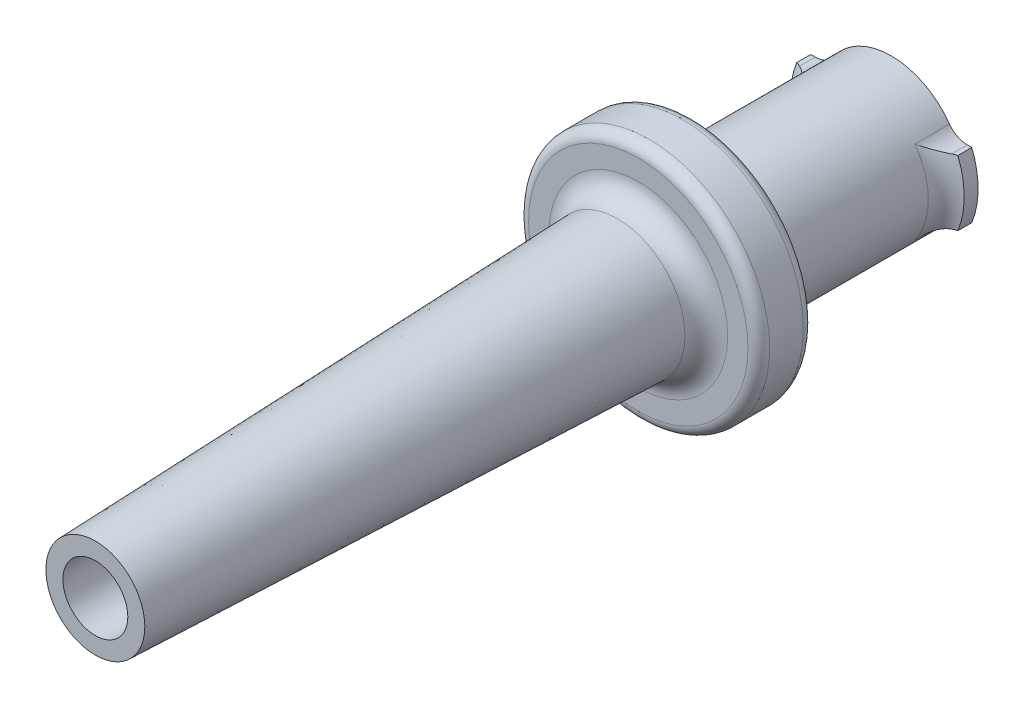
ISO-10303-21;
HEADER;
FILE_DESCRIPTION(('STEP AP214'),'2;1');
FILE_NAME('part.step','',(''),(''),'','','');
FILE_SCHEMA(('AUTOMOTIVE_DESIGN { 1 0 10303 214 1 1 1 1 }'));
ENDSEC;
DATA;
#1=APPLICATION_CONTEXT('core data for automotive mechanical design processes');
#2=APPLICATION_PROTOCOL_DEFINITION('international standard','automotive_design',2000,#1);
#3=PRODUCT_CONTEXT('',#1,'mechanical');
#4=PRODUCT('Part','Part','',(#3));
#5=PRODUCT_RELATED_PRODUCT_CATEGORY('part','',(#4));
#6=PRODUCT_DEFINITION_FORMATION('','',#4);
#7=PRODUCT_DEFINITION_CONTEXT('part definition',#1,'design');
#8=PRODUCT_DEFINITION('design','',#6,#7);
#9=PRODUCT_DEFINITION_SHAPE('','',#8);
#10=(LENGTH_UNIT() NAMED_UNIT(*) SI_UNIT(.MILLI.,.METRE.));
#11=(NAMED_UNIT(*) PLANE_ANGLE_UNIT() SI_UNIT($,.RADIAN.));
#12=(NAMED_UNIT(*) SI_UNIT($,.STERADIAN.) SOLID_ANGLE_UNIT());
#13=UNCERTAINTY_MEASURE_WITH_UNIT(LENGTH_MEASURE(1.E-05),#10,'distance_accuracy_value','');
#14=(GEOMETRIC_REPRESENTATION_CONTEXT(3) GLOBAL_UNCERTAINTY_ASSIGNED_CONTEXT((#13)) GLOBAL_UNIT_ASSIGNED_CONTEXT((#10,
#11,#12)) REPRESENTATION_CONTEXT('',''));
#15=CARTESIAN_POINT('',(0.,0.,0.));
#16=DIRECTION('',(0.,0.,1.));
#17=DIRECTION('',(1.,0.,0.));
#18=AXIS2_PLACEMENT_3D('',#15,#16,#17);
#19=CARTESIAN_POINT('',(0.,0.,11.65));
#20=DIRECTION('',(0.,0.,1.));
#21=DIRECTION('',(1.,0.,0.));
#22=AXIS2_PLACEMENT_3D('',#19,#20,#21);
#23=PLANE('',#22);
#24=CARTESIAN_POINT('',(0.,0.,11.65));
#25=DIRECTION('',(0.,0.,1.));
#26=DIRECTION('',(1.,0.,0.));
#27=AXIS2_PLACEMENT_3D('',#24,#25,#26);
#28=CIRCLE('',#27,5.05);
#29=CARTESIAN_POINT('',(5.05,0.,11.65));
#30=VERTEX_POINT('',#29);
#31=EDGE_CURVE('E235',#30,#30,#28,.T.);
#32=ORIENTED_EDGE('',*,*,#31,.T.);
#33=EDGE_LOOP('',(#32));
#34=FACE_BOUND('',#33,.T.);
#35=CARTESIAN_POINT('',(0.,0.,11.65));
#36=DIRECTION('',(0.,0.,1.));
#37=DIRECTION('',(1.,0.,0.));
#38=AXIS2_PLACEMENT_3D('',#35,#36,#37);
#39=CIRCLE('',#38,4.11568877480708);
#40=CARTESIAN_POINT('',(4.11568877480708,0.,11.65));
#41=VERTEX_POINT('',#40);
#42=EDGE_CURVE('E232',#41,#41,#39,.F.);
#43=ORIENTED_EDGE('',*,*,#42,.T.);
#44=EDGE_LOOP('',(#43));
#45=FACE_BOUND('',#44,.T.);
#46=ADVANCED_FACE('F35',(#34,#45),#23,.T.);
#47=CARTESIAN_POINT('',(0.,1.5,0.64));
#48=DIRECTION('',(0.,-1.,0.));
#49=DIRECTION('',(1.,0.,0.));
#50=AXIS2_PLACEMENT_3D('',#47,#48,#49);
#51=PLANE('',#50);
#52=CARTESIAN_POINT('',(-3.70809924354783,1.5,0.64));
#53=CARTESIAN_POINT('',(-3.64737667205813,1.5,0.657679951316053));
#54=CARTESIAN_POINT('',(-3.58809548224564,1.5,0.680399848702581));
#55=CARTESIAN_POINT('',(-3.47390860919652,1.5,0.735387924779916));
#56=CARTESIAN_POINT('',(-3.4190177068852,1.5,0.767686765791125));
#57=CARTESIAN_POINT('',(-3.31544585192596,1.5,0.841230664962935));
#58=CARTESIAN_POINT('',(-3.26677378504799,1.5,0.882488301752746));
#59=CARTESIAN_POINT('',(-3.17759469637664,1.5,0.973008164892605));
#60=CARTESIAN_POINT('',(-3.1370786222244,1.5,1.02226140594474));
#61=CARTESIAN_POINT('',(-3.06807728624579,1.5,1.12455393615389));
#62=CARTESIAN_POINT('',(-3.03903954364431,1.5,1.17721947044101));
#63=CARTESIAN_POINT('',(-2.99144671397061,1.5,1.28706677175));
#64=CARTESIAN_POINT('',(-2.97287334553093,1.5,1.34424046246232));
#65=CARTESIAN_POINT('',(-2.9532436479617,1.5,1.43403388480849));
#66=CARTESIAN_POINT('',(-2.94805885931405,1.5,1.46579721780006));
#67=CARTESIAN_POINT('',(-2.94112879306822,1.5,1.52967914452873));
#68=CARTESIAN_POINT('',(-2.9393816875974,1.5,1.56179754033168));
#69=CARTESIAN_POINT('',(-2.93938769133994,1.5,1.59393920141697));
#70=B_SPLINE_CURVE_WITH_KNOTS('',3,(#52,#53,#54,#55,#56,#57,#58,#59,#60,#61,#62,#63,#64,#65,#66,
#67,#68,#69),.UNSPECIFIED.,.F.,.F.,(4,2,2,2,2,2,2,2,4),(0.,0.189563466531215,0.379740400726355,
0.570186100272554,0.76041924380344,0.939851108342601,1.11896852379387,1.21535304129187,
1.31168629569361),.UNSPECIFIED.);
#71=CARTESIAN_POINT('',(-3.70809924354783,1.5,0.64));
#72=VERTEX_POINT('',#71);
#73=CARTESIAN_POINT('',(-3.49857113690585,1.5,0.724151839840245));
#74=VERTEX_POINT('',#73);
#75=EDGE_CURVE('E140',#72,#74,#70,.T.);
#76=ORIENTED_EDGE('',*,*,#75,.T.);
#77=DIRECTION('',(0.,0.,-1.));
#78=VECTOR('',#77,1.);
#79=CARTESIAN_POINT('',(-3.49857113690718,1.5,0.64));
#80=LINE('',#79,#78);
#81=CARTESIAN_POINT('',(-3.49857113690718,1.5,0.));
#82=VERTEX_POINT('',#81);
#83=EDGE_CURVE('E383',#74,#82,#80,.T.);
#84=ORIENTED_EDGE('',*,*,#83,.T.);
#85=DIRECTION('',(-1.,0.,0.));
#86=VECTOR('',#85,1.);
#87=CARTESIAN_POINT('',(0.,1.5,0.));
#88=LINE('',#87,#86);
#89=CARTESIAN_POINT('',(-3.70809924354783,1.5,0.));
#90=VERTEX_POINT('',#89);
#91=EDGE_CURVE('E142',#82,#90,#88,.T.);
#92=ORIENTED_EDGE('',*,*,#91,.T.);
#93=DIRECTION('',(0.,0.,-1.));
#94=VECTOR('',#93,1.);
#95=CARTESIAN_POINT('',(-3.70809924354783,1.5,0.64));
#96=LINE('',#95,#94);
#97=EDGE_CURVE('E131',#72,#90,#96,.T.);
#98=ORIENTED_EDGE('',*,*,#97,.F.);
#99=EDGE_LOOP('',(#76,#84,#92,#98));
#100=FACE_BOUND('',#99,.T.);
#101=ADVANCED_FACE('F139',(#100),#51,.F.);
#102=CARTESIAN_POINT('',(0.,-1.5,0.64));
#103=DIRECTION('',(0.,-1.,0.));
#104=DIRECTION('',(1.,0.,0.));
#105=AXIS2_PLACEMENT_3D('',#102,#103,#104);
#106=PLANE('',#105);
#107=DIRECTION('',(-1.,0.,0.));
#108=VECTOR('',#107,1.);
#109=CARTESIAN_POINT('',(0.,-1.5,0.));
#110=LINE('',#109,#108);
#111=CARTESIAN_POINT('',(-3.49857113690718,-1.5,0.));
#112=VERTEX_POINT('',#111);
#113=CARTESIAN_POINT('',(-3.70809924354783,-1.5,0.));
#114=VERTEX_POINT('',#113);
#115=EDGE_CURVE('E298',#112,#114,#110,.T.);
#116=ORIENTED_EDGE('',*,*,#115,.F.);
#117=DIRECTION('',(0.,0.,1.));
#118=VECTOR('',#117,1.);
#119=CARTESIAN_POINT('',(-3.49857113690718,-1.5,1.59393920141695));
#120=LINE('',#119,#118);
#121=CARTESIAN_POINT('',(-3.49857113690718,-1.5,0.724151839839552));
#122=VERTEX_POINT('',#121);
#123=EDGE_CURVE('E372',#112,#122,#120,.T.);
#124=ORIENTED_EDGE('',*,*,#123,.T.);
#125=CARTESIAN_POINT('',(-2.93938769133981,-1.5,1.59393920141695));
#126=CARTESIAN_POINT('',(-2.93938571546912,-1.5,1.56781721229562));
#127=CARTESIAN_POINT('',(-2.94053765896739,-1.5,1.54170889725141));
#128=CARTESIAN_POINT('',(-2.94511887636671,-1.5,1.48970160424627));
#129=CARTESIAN_POINT('',(-2.94854737332306,-1.5,1.46380255791702));
#130=CARTESIAN_POINT('',(-2.96215986146523,-1.5,1.38690988271111));
#131=CARTESIAN_POINT('',(-2.97567150516193,-1.5,1.33646907387104));
#132=CARTESIAN_POINT('',(-3.01088785356483,-1.5,1.2386383549368));
#133=CARTESIAN_POINT('',(-3.03258513505815,-1.5,1.1912457260185));
#134=CARTESIAN_POINT('',(-3.08324366181701,-1.5,1.10049614193924));
#135=CARTESIAN_POINT('',(-3.11220966096846,-1.5,1.0571418534779));
#136=CARTESIAN_POINT('',(-3.17802550383664,-1.5,0.973209657344297));
#137=CARTESIAN_POINT('',(-3.21520602392207,-1.5,0.932891919895729));
#138=CARTESIAN_POINT('',(-3.29527356836177,-1.5,0.858348188677426));
#139=CARTESIAN_POINT('',(-3.33816567294797,-1.5,0.824127682257134));
#140=CARTESIAN_POINT('',(-3.43297836957665,-1.5,0.759282763278328));
#141=CARTESIAN_POINT('',(-3.48537244312384,-1.5,0.729350671013341));
#142=CARTESIAN_POINT('',(-3.59411743007106,-1.5,0.678107552693631));
#143=CARTESIAN_POINT('',(-3.65046170197082,-1.5,0.656782445138312));
#144=CARTESIAN_POINT('',(-3.70809924354783,-1.5,0.64));
#145=B_SPLINE_CURVE_WITH_KNOTS('',3,(#125,#126,#127,#128,#129,#130,#131,#132,#133,#134,#135,
#136,#137,#138,#139,#140,#141,#142,#143,#144),.UNSPECIFIED.,.F.,.F.,(4,2,2,2,2,2,2,2,2,4),(0.,
0.0783140176743149,0.156601321981189,0.312431311771733,0.468120324227024,0.623911426991152,
0.787773017702309,0.95178134278255,1.13204090642092,1.31200434824557),.UNSPECIFIED.);
#146=CARTESIAN_POINT('',(-3.70809924354783,-1.5,0.64));
#147=VERTEX_POINT('',#146);
#148=EDGE_CURVE('E148',#122,#147,#145,.T.);
#149=ORIENTED_EDGE('',*,*,#148,.T.);
#150=DIRECTION('',(0.,0.,-1.));
#151=VECTOR('',#150,1.);
#152=CARTESIAN_POINT('',(-3.70809924354783,-1.5,0.64));
#153=LINE('',#152,#151);
#154=EDGE_CURVE('E133',#147,#114,#153,.T.);
#155=ORIENTED_EDGE('',*,*,#154,.T.);
#156=EDGE_LOOP('',(#116,#124,#149,#155));
#157=FACE_BOUND('',#156,.T.);
#158=ADVANCED_FACE('F350',(#157),#106,.T.);
#159=CARTESIAN_POINT('',(3.70809924354783,1.5,0.));
#160=VERTEX_POINT('',#159);
#161=CARTESIAN_POINT('',(3.49857113690718,1.5,0.));
#162=VERTEX_POINT('',#161);
#163=EDGE_CURVE('E293',#160,#162,#88,.T.);
#164=ORIENTED_EDGE('',*,*,#163,.T.);
#165=DIRECTION('',(0.,0.,-1.));
#166=VECTOR('',#165,1.);
#167=CARTESIAN_POINT('',(3.49857113690718,1.5,0.64));
#168=LINE('',#167,#166);
#169=CARTESIAN_POINT('',(3.49857113690718,1.5,0.724151839839552));
#170=VERTEX_POINT('',#169);
#171=EDGE_CURVE('E381',#162,#170,#168,.F.);
#172=ORIENTED_EDGE('',*,*,#171,.T.);
#173=CARTESIAN_POINT('',(2.93938769133981,1.5,1.59393920141695));
#174=CARTESIAN_POINT('',(2.93938571546912,1.5,1.56781721229562));
#175=CARTESIAN_POINT('',(2.94053765896739,1.5,1.54170889725141));
#176=CARTESIAN_POINT('',(2.94511887636671,1.5,1.48970160424627));
#177=CARTESIAN_POINT('',(2.94854737332306,1.5,1.46380255791702));
#178=CARTESIAN_POINT('',(2.96215986146523,1.5,1.38690988271111));
#179=CARTESIAN_POINT('',(2.97567150516193,1.5,1.33646907387104));
#180=CARTESIAN_POINT('',(3.01088785356483,1.5,1.2386383549368));
#181=CARTESIAN_POINT('',(3.03258513505815,1.5,1.1912457260185));
#182=CARTESIAN_POINT('',(3.08324366181701,1.5,1.10049614193925));
#183=CARTESIAN_POINT('',(3.11220966096846,1.5,1.0571418534779));
#184=CARTESIAN_POINT('',(3.17802550383664,1.5,0.973209657344296));
#185=CARTESIAN_POINT('',(3.21520602392207,1.5,0.932891919895728));
#186=CARTESIAN_POINT('',(3.29527356836177,1.5,0.858348188677426));
#187=CARTESIAN_POINT('',(3.33816567294797,1.5,0.824127682257133));
#188=CARTESIAN_POINT('',(3.43297836957665,1.5,0.759282763278327));
#189=CARTESIAN_POINT('',(3.48537244312384,1.5,0.729350671013341));
#190=CARTESIAN_POINT('',(3.59411743007106,1.5,0.678107552693631));
#191=CARTESIAN_POINT('',(3.65046170197082,1.5,0.656782445138311));
#192=CARTESIAN_POINT('',(3.70809924354783,1.5,0.64));
#193=B_SPLINE_CURVE_WITH_KNOTS('',3,(#173,#174,#175,#176,#177,#178,#179,#180,#181,#182,#183,
#184,#185,#186,#187,#188,#189,#190,#191,#192),.UNSPECIFIED.,.F.,.F.,(4,2,2,2,2,2,2,2,2,4),(0.,
0.0783140176743151,0.156601321981189,0.312431311771733,0.468120324227024,0.623911426991152,
0.787773017702309,0.95178134278255,1.13204090642092,1.31200434824557),.UNSPECIFIED.);
#194=CARTESIAN_POINT('',(3.70809924354783,1.5,0.64));
#195=VERTEX_POINT('',#194);
#196=EDGE_CURVE('E358',#170,#195,#193,.T.);
#197=ORIENTED_EDGE('',*,*,#196,.T.);
#198=DIRECTION('',(0.,0.,-1.));
#199=VECTOR('',#198,1.);
#200=CARTESIAN_POINT('',(3.70809924354783,1.5,0.64));
#201=LINE('',#200,#199);
#202=EDGE_CURVE('E302',#195,#160,#201,.T.);
#203=ORIENTED_EDGE('',*,*,#202,.T.);
#204=EDGE_LOOP('',(#164,#172,#197,#203));
#205=FACE_BOUND('',#204,.T.);
#206=ADVANCED_FACE('F166',(#205),#51,.F.);
#207=CARTESIAN_POINT('',(0.,0.,0.64));
#208=DIRECTION('',(0.,0.,-1.));
#209=DIRECTION('',(-1.,0.,0.));
#210=AXIS2_PLACEMENT_3D('',#207,#208,#209);
#211=CYLINDRICAL_SURFACE('',#210,4.);
#212=CARTESIAN_POINT('',(0.,0.,0.));
#213=DIRECTION('',(0.,0.,1.));
#214=DIRECTION('',(1.,0.,0.));
#215=AXIS2_PLACEMENT_3D('',#212,#213,#214);
#216=CIRCLE('',#215,4.);
#217=EDGE_CURVE('E296',#90,#114,#216,.T.);
#218=ORIENTED_EDGE('',*,*,#217,.T.);
#219=ORIENTED_EDGE('',*,*,#154,.F.);
#220=CARTESIAN_POINT('',(0.,0.,0.64));
#221=DIRECTION('',(0.,0.,1.));
#222=DIRECTION('',(1.,0.,0.));
#223=AXIS2_PLACEMENT_3D('',#220,#221,#222);
#224=CIRCLE('',#223,4.);
#225=EDGE_CURVE('E127',#72,#147,#224,.T.);
#226=ORIENTED_EDGE('',*,*,#225,.F.);
#227=ORIENTED_EDGE('',*,*,#97,.T.);
#228=EDGE_LOOP('',(#218,#219,#226,#227));
#229=FACE_BOUND('',#228,.T.);
#230=ADVANCED_FACE('F130',(#229),#211,.T.);
#231=CARTESIAN_POINT('',(3.70809924354783,-1.5,0.64));
#232=CARTESIAN_POINT('',(3.64737667205813,-1.5,0.657679951316053));
#233=CARTESIAN_POINT('',(3.58809548224564,-1.5,0.680399848702581));
#234=CARTESIAN_POINT('',(3.47390860919652,-1.5,0.735387924779916));
#235=CARTESIAN_POINT('',(3.4190177068852,-1.5,0.767686765791125));
#236=CARTESIAN_POINT('',(3.31544585192596,-1.5,0.841230664962935));
#237=CARTESIAN_POINT('',(3.26677378504799,-1.5,0.882488301752746));
#238=CARTESIAN_POINT('',(3.17759469637664,-1.5,0.973008164892605));
#239=CARTESIAN_POINT('',(3.1370786222244,-1.5,1.02226140594474));
#240=CARTESIAN_POINT('',(3.06807728624579,-1.5,1.12455393615389));
#241=CARTESIAN_POINT('',(3.03903954364431,-1.5,1.17721947044101));
#242=CARTESIAN_POINT('',(2.99144671397061,-1.5,1.28706677175));
#243=CARTESIAN_POINT('',(2.97287334553093,-1.5,1.34424046246232));
#244=CARTESIAN_POINT('',(2.9532436479617,-1.5,1.43403388480849));
#245=CARTESIAN_POINT('',(2.94805885931405,-1.5,1.46579721780006));
#246=CARTESIAN_POINT('',(2.94112879306822,-1.5,1.52967914452873));
#247=CARTESIAN_POINT('',(2.9393816875974,-1.5,1.56179754033168));
#248=CARTESIAN_POINT('',(2.93938769133994,-1.5,1.59393920141697));
#249=B_SPLINE_CURVE_WITH_KNOTS('',3,(#231,#232,#233,#234,#235,#236,#237,#238,#239,#240,#241,
#242,#243,#244,#245,#246,#247,#248),.UNSPECIFIED.,.F.,.F.,(4,2,2,2,2,2,2,2,4),(0.,
0.189563466531215,0.379740400726355,0.570186100272554,0.760419243803441,0.939851108342601,
1.11896852379387,1.21535304129187,1.31168629569362),.UNSPECIFIED.);
#250=CARTESIAN_POINT('',(3.70809924354783,-1.5,0.64));
#251=VERTEX_POINT('',#250);
#252=CARTESIAN_POINT('',(3.49857113690585,-1.5,0.724151839840245));
#253=VERTEX_POINT('',#252);
#254=EDGE_CURVE('E353',#251,#253,#249,.T.);
#255=ORIENTED_EDGE('',*,*,#254,.T.);
#256=DIRECTION('',(0.,0.,1.));
#257=VECTOR('',#256,1.);
#258=CARTESIAN_POINT('',(3.49857113690718,-1.5,0.));
#259=LINE('',#258,#257);
#260=CARTESIAN_POINT('',(3.49857113690718,-1.5,0.));
#261=VERTEX_POINT('',#260);
#262=EDGE_CURVE('E375',#253,#261,#259,.F.);
#263=ORIENTED_EDGE('',*,*,#262,.T.);
#264=CARTESIAN_POINT('',(3.70809924354783,-1.5,0.));
#265=VERTEX_POINT('',#264);
#266=EDGE_CURVE('E299',#265,#261,#110,.T.);
#267=ORIENTED_EDGE('',*,*,#266,.F.);
#268=DIRECTION('',(0.,0.,-1.));
#269=VECTOR('',#268,1.);
#270=CARTESIAN_POINT('',(3.70809924354783,-1.5,0.64));
#271=LINE('',#270,#269);
#272=EDGE_CURVE('E305',#251,#265,#271,.T.);
#273=ORIENTED_EDGE('',*,*,#272,.F.);
#274=EDGE_LOOP('',(#255,#263,#267,#273));
#275=FACE_BOUND('',#274,.T.);
#276=ADVANCED_FACE('F345',(#275),#106,.T.);
#277=EDGE_CURVE('E136',#265,#160,#216,.T.);
#278=ORIENTED_EDGE('',*,*,#277,.T.);
#279=ORIENTED_EDGE('',*,*,#202,.F.);
#280=EDGE_CURVE('E135',#251,#195,#224,.T.);
#281=ORIENTED_EDGE('',*,*,#280,.F.);
#282=ORIENTED_EDGE('',*,*,#272,.T.);
#283=EDGE_LOOP('',(#278,#279,#281,#282));
#284=FACE_BOUND('',#283,.T.);
#285=ADVANCED_FACE('F342',(#284),#211,.T.);
#286=CARTESIAN_POINT('',(0.,0.,0.));
#287=DIRECTION('',(0.,0.,1.));
#288=DIRECTION('',(1.,0.,0.));
#289=AXIS2_PLACEMENT_3D('',#286,#287,#288);
#290=PLANE('',#289);
#291=CARTESIAN_POINT('',(0.,0.,0.));
#292=DIRECTION('',(0.,0.,-1.));
#293=DIRECTION('',(-1.,0.,0.));
#294=AXIS2_PLACEMENT_3D('',#291,#292,#293);
#295=CIRCLE('',#294,2.13);
#296=CARTESIAN_POINT('',(-2.13,0.,0.));
#297=VERTEX_POINT('',#296);
#298=EDGE_CURVE('E273',#297,#297,#295,.T.);
#299=ORIENTED_EDGE('',*,*,#298,.F.);
#300=EDGE_LOOP('',(#299));
#301=FACE_BOUND('',#300,.T.);
#302=ORIENTED_EDGE('',*,*,#266,.T.);
#303=CARTESIAN_POINT('',(3.49857113690718,-2.5,0.));
#304=DIRECTION('',(0.,0.,1.));
#305=DIRECTION('',(1.,0.,0.));
#306=AXIS2_PLACEMENT_3D('',#303,#304,#305);
#307=CIRCLE('',#306,1.);
#308=CARTESIAN_POINT('',(2.6849499422776,-1.91860465116279,0.));
#309=VERTEX_POINT('',#308);
#310=EDGE_CURVE('E196',#261,#309,#307,.T.);
#311=ORIENTED_EDGE('',*,*,#310,.T.);
#312=CARTESIAN_POINT('',(0.,0.,0.));
#313=DIRECTION('',(0.,0.,-1.));
#314=DIRECTION('',(-1.,0.,0.));
#315=AXIS2_PLACEMENT_3D('',#312,#313,#314);
#316=CIRCLE('',#315,3.3);
#317=CARTESIAN_POINT('',(-2.6849499422776,-1.91860465116279,0.));
#318=VERTEX_POINT('',#317);
#319=EDGE_CURVE('E289',#309,#318,#316,.T.);
#320=ORIENTED_EDGE('',*,*,#319,.T.);
#321=CARTESIAN_POINT('',(-3.49857113690718,-2.5,0.));
#322=DIRECTION('',(0.,0.,1.));
#323=DIRECTION('',(1.,0.,0.));
#324=AXIS2_PLACEMENT_3D('',#321,#322,#323);
#325=CIRCLE('',#324,1.);
#326=EDGE_CURVE('E190',#318,#112,#325,.T.);
#327=ORIENTED_EDGE('',*,*,#326,.T.);
#328=ORIENTED_EDGE('',*,*,#115,.T.);
#329=ORIENTED_EDGE('',*,*,#217,.F.);
#330=ORIENTED_EDGE('',*,*,#91,.F.);
#331=CARTESIAN_POINT('',(-3.49857113690718,2.5,0.));
#332=DIRECTION('',(0.,0.,1.));
#333=DIRECTION('',(1.,0.,0.));
#334=AXIS2_PLACEMENT_3D('',#331,#332,#333);
#335=CIRCLE('',#334,1.);
#336=CARTESIAN_POINT('',(-2.6849499422776,1.91860465116279,0.));
#337=VERTEX_POINT('',#336);
#338=EDGE_CURVE('E50',#82,#337,#335,.T.);
#339=ORIENTED_EDGE('',*,*,#338,.T.);
#340=CARTESIAN_POINT('',(2.6849499422776,1.91860465116279,0.));
#341=VERTEX_POINT('',#340);
#342=EDGE_CURVE('E290',#337,#341,#316,.T.);
#343=ORIENTED_EDGE('',*,*,#342,.T.);
#344=CARTESIAN_POINT('',(3.49857113690718,2.5,0.));
#345=DIRECTION('',(0.,0.,1.));
#346=DIRECTION('',(1.,0.,0.));
#347=AXIS2_PLACEMENT_3D('',#344,#345,#346);
#348=CIRCLE('',#347,1.);
#349=EDGE_CURVE('E217',#341,#162,#348,.T.);
#350=ORIENTED_EDGE('',*,*,#349,.T.);
#351=ORIENTED_EDGE('',*,*,#163,.F.);
#352=ORIENTED_EDGE('',*,*,#277,.F.);
#353=EDGE_LOOP('',(#302,#311,#320,#327,#328,#329,#330,#339,#343,#350,#351,#352));
#354=FACE_BOUND('',#353,.T.);
#355=ADVANCED_FACE('F338',(#301,#354),#290,.F.);
#356=CARTESIAN_POINT('',(0.,0.,9.1));
#357=DIRECTION('',(0.,0.,-1.));
#358=DIRECTION('',(-1.,0.,0.));
#359=AXIS2_PLACEMENT_3D('',#356,#357,#358);
#360=CYLINDRICAL_SURFACE('',#359,3.3);
#361=CARTESIAN_POINT('',(0.,0.,8.1));
#362=DIRECTION('',(0.,0.,1.));
#363=DIRECTION('',(1.,0.,0.));
#364=AXIS2_PLACEMENT_3D('',#361,#362,#363);
#365=CIRCLE('',#364,3.3);
#366=CARTESIAN_POINT('',(3.3,0.,8.1));
#367=VERTEX_POINT('',#366);
#368=EDGE_CURVE('E223',#367,#367,#365,.F.);
#369=ORIENTED_EDGE('',*,*,#368,.T.);
#370=EDGE_LOOP('',(#369));
#371=FACE_BOUND('',#370,.T.);
#372=CARTESIAN_POINT('',(0.,0.,1.59393920141695));
#373=DIRECTION('',(0.,0.,-1.));
#374=DIRECTION('',(-1.,0.,0.));
#375=AXIS2_PLACEMENT_3D('',#372,#373,#374);
#376=CIRCLE('',#375,3.3);
#377=CARTESIAN_POINT('',(-2.6849499422776,1.91860465116279,1.59393920141695));
#378=VERTEX_POINT('',#377);
#379=CARTESIAN_POINT('',(-2.6849499422776,-1.91860465116279,1.59393920141695));
#380=VERTEX_POINT('',#379);
#381=EDGE_CURVE('E153',#378,#380,#376,.F.);
#382=ORIENTED_EDGE('',*,*,#381,.T.);
#383=DIRECTION('',(0.,0.,-1.));
#384=VECTOR('',#383,1.);
#385=CARTESIAN_POINT('',(-2.6849499422776,-1.91860465116279,9.1));
#386=LINE('',#385,#384);
#387=EDGE_CURVE('E366',#380,#318,#386,.T.);
#388=ORIENTED_EDGE('',*,*,#387,.T.);
#389=ORIENTED_EDGE('',*,*,#319,.F.);
#390=DIRECTION('',(0.,0.,-1.));
#391=VECTOR('',#390,1.);
#392=CARTESIAN_POINT('',(2.68494994227761,-1.91860465116279,9.1));
#393=LINE('',#392,#391);
#394=CARTESIAN_POINT('',(2.6849499422776,-1.91860465116279,1.59393920141695));
#395=VERTEX_POINT('',#394);
#396=EDGE_CURVE('E373',#309,#395,#393,.F.);
#397=ORIENTED_EDGE('',*,*,#396,.T.);
#398=CARTESIAN_POINT('',(0.,0.,1.59393920141695));
#399=DIRECTION('',(0.,0.,-1.));
#400=DIRECTION('',(-1.,0.,0.));
#401=AXIS2_PLACEMENT_3D('',#398,#399,#400);
#402=CIRCLE('',#401,3.3);
#403=CARTESIAN_POINT('',(2.6849499422776,1.91860465116279,1.59393920141695));
#404=VERTEX_POINT('',#403);
#405=EDGE_CURVE('E144',#395,#404,#402,.F.);
#406=ORIENTED_EDGE('',*,*,#405,.T.);
#407=DIRECTION('',(0.,0.,-1.));
#408=VECTOR('',#407,1.);
#409=CARTESIAN_POINT('',(2.6849499422776,1.91860465116279,9.1));
#410=LINE('',#409,#408);
#411=EDGE_CURVE('E151',#404,#341,#410,.T.);
#412=ORIENTED_EDGE('',*,*,#411,.T.);
#413=ORIENTED_EDGE('',*,*,#342,.F.);
#414=DIRECTION('',(0.,0.,-1.));
#415=VECTOR('',#414,1.);
#416=CARTESIAN_POINT('',(-2.68494994227761,1.91860465116279,9.1));
#417=LINE('',#416,#415);
#418=EDGE_CURVE('E147',#337,#378,#417,.F.);
#419=ORIENTED_EDGE('',*,*,#418,.T.);
#420=EDGE_LOOP('',(#382,#388,#389,#397,#406,#412,#413,#419));
#421=FACE_BOUND('',#420,.T.);
#422=ADVANCED_FACE('F334',(#371,#421),#360,.T.);
#423=CARTESIAN_POINT('',(0.,0.,0.));
#424=DIRECTION('',(0.,0.,-1.));
#425=DIRECTION('',(-1.,0.,0.));
#426=AXIS2_PLACEMENT_3D('',#423,#424,#425);
#427=CONICAL_SURFACE('',#426,2.13,0.0698131700797732);
#428=CARTESIAN_POINT('',(0.,0.,9.1));
#429=DIRECTION('',(0.,0.,-1.));
#430=DIRECTION('',(-1.,0.,0.));
#431=AXIS2_PLACEMENT_3D('',#428,#429,#430);
#432=CIRCLE('',#431,1.49366601131406);
#433=CARTESIAN_POINT('',(-1.49366601131406,0.,9.1));
#434=VERTEX_POINT('',#433);
#435=EDGE_CURVE('E277',#434,#434,#432,.T.);
#436=ORIENTED_EDGE('',*,*,#435,.F.);
#437=EDGE_LOOP('',(#436));
#438=FACE_BOUND('',#437,.T.);
#439=ORIENTED_EDGE('',*,*,#298,.T.);
#440=EDGE_LOOP('',(#439));
#441=FACE_BOUND('',#440,.T.);
#442=ADVANCED_FACE('F328',(#438,#441),#427,.F.);
#443=CARTESIAN_POINT('',(0.,0.,9.1));
#444=DIRECTION('',(0.,0.,1.));
#445=DIRECTION('',(1.,0.,0.));
#446=AXIS2_PLACEMENT_3D('',#443,#444,#445);
#447=PLANE('',#446);
#448=CARTESIAN_POINT('',(0.,0.,9.1));
#449=DIRECTION('',(0.,0.,1.));
#450=DIRECTION('',(1.,0.,0.));
#451=AXIS2_PLACEMENT_3D('',#448,#449,#450);
#452=CIRCLE('',#451,5.05);
#453=CARTESIAN_POINT('',(5.05,0.,9.1));
#454=VERTEX_POINT('',#453);
#455=EDGE_CURVE('E11',#454,#454,#452,.F.);
#456=ORIENTED_EDGE('',*,*,#455,.T.);
#457=EDGE_LOOP('',(#456));
#458=FACE_BOUND('',#457,.T.);
#459=CARTESIAN_POINT('',(0.,0.,9.1));
#460=DIRECTION('',(0.,0.,1.));
#461=DIRECTION('',(1.,0.,0.));
#462=AXIS2_PLACEMENT_3D('',#459,#460,#461);
#463=CIRCLE('',#462,4.3);
#464=CARTESIAN_POINT('',(4.3,0.,9.1));
#465=VERTEX_POINT('',#464);
#466=EDGE_CURVE('E226',#465,#465,#463,.T.);
#467=ORIENTED_EDGE('',*,*,#466,.T.);
#468=EDGE_LOOP('',(#467));
#469=FACE_BOUND('',#468,.T.);
#470=ADVANCED_FACE('F325',(#458,#469),#447,.F.);
#471=CARTESIAN_POINT('',(0.,0.,11.65));
#472=DIRECTION('',(0.,0.,-1.));
#473=DIRECTION('',(-1.,0.,0.));
#474=AXIS2_PLACEMENT_3D('',#471,#472,#473);
#475=CYLINDRICAL_SURFACE('',#474,5.55);
#476=CARTESIAN_POINT('',(0.,0.,11.15));
#477=DIRECTION('',(0.,0.,1.));
#478=DIRECTION('',(1.,0.,0.));
#479=AXIS2_PLACEMENT_3D('',#476,#477,#478);
#480=CIRCLE('',#479,5.55);
#481=CARTESIAN_POINT('',(5.55,0.,11.15));
#482=VERTEX_POINT('',#481);
#483=EDGE_CURVE('E43',#482,#482,#480,.F.);
#484=ORIENTED_EDGE('',*,*,#483,.T.);
#485=EDGE_LOOP('',(#484));
#486=FACE_BOUND('',#485,.T.);
#487=CARTESIAN_POINT('',(0.,0.,9.6));
#488=DIRECTION('',(0.,0.,1.));
#489=DIRECTION('',(1.,0.,0.));
#490=AXIS2_PLACEMENT_3D('',#487,#488,#489);
#491=CIRCLE('',#490,5.55);
#492=CARTESIAN_POINT('',(5.55,0.,9.6));
#493=VERTEX_POINT('',#492);
#494=EDGE_CURVE('E238',#493,#493,#491,.T.);
#495=ORIENTED_EDGE('',*,*,#494,.T.);
#496=EDGE_LOOP('',(#495));
#497=FACE_BOUND('',#496,.T.);
#498=ADVANCED_FACE('F243',(#486,#497),#475,.T.);
#499=CARTESIAN_POINT('',(0.,0.,11.65));
#500=DIRECTION('',(0.,0.,-1.));
#501=DIRECTION('',(-1.,0.,0.));
#502=AXIS2_PLACEMENT_3D('',#499,#500,#501);
#503=CYLINDRICAL_SURFACE('',#502,1.49366601131406);
#504=CARTESIAN_POINT('',(0.,0.,11.65));
#505=DIRECTION('',(0.,0.,1.));
#506=DIRECTION('',(1.,0.,0.));
#507=AXIS2_PLACEMENT_3D('',#504,#505,#506);
#508=CIRCLE('',#507,1.49366601131406);
#509=CARTESIAN_POINT('',(1.49366601131406,0.,11.65));
#510=VERTEX_POINT('',#509);
#511=EDGE_CURVE('E274',#510,#510,#508,.T.);
#512=ORIENTED_EDGE('',*,*,#511,.T.);
#513=EDGE_LOOP('',(#512));
#514=FACE_BOUND('',#513,.T.);
#515=ORIENTED_EDGE('',*,*,#435,.T.);
#516=EDGE_LOOP('',(#515));
#517=FACE_BOUND('',#516,.T.);
#518=ADVANCED_FACE('F267',(#514,#517),#503,.F.);
#519=CARTESIAN_POINT('',(0.,0.,11.65));
#520=DIRECTION('',(0.,0.,-1.));
#521=DIRECTION('',(1.,0.,0.));
#522=AXIS2_PLACEMENT_3D('',#519,#520,#521);
#523=CONICAL_SURFACE('',#522,3.15,0.0349065850398866);
#524=CARTESIAN_POINT('',(0.,0.,12.6151005032975));
#525=DIRECTION('',(0.,0.,1.));
#526=DIRECTION('',(1.,0.,0.));
#527=AXIS2_PLACEMENT_3D('',#524,#525,#526);
#528=CIRCLE('',#527,3.11629794778798);
#529=CARTESIAN_POINT('',(3.11629794778798,0.,12.6151005032975));
#530=VERTEX_POINT('',#529);
#531=EDGE_CURVE('E229',#530,#530,#528,.T.);
#532=ORIENTED_EDGE('',*,*,#531,.T.);
#533=EDGE_LOOP('',(#532));
#534=FACE_BOUND('',#533,.T.);
#535=CARTESIAN_POINT('',(0.,0.,36.65));
#536=DIRECTION('',(0.,0.,1.));
#537=DIRECTION('',(1.,0.,0.));
#538=AXIS2_PLACEMENT_3D('',#535,#536,#537);
#539=CIRCLE('',#538,2.27698076270631);
#540=CARTESIAN_POINT('',(2.27698076270631,0.,36.65));
#541=VERTEX_POINT('',#540);
#542=EDGE_CURVE('E271',#541,#541,#539,.T.);
#543=ORIENTED_EDGE('',*,*,#542,.F.);
#544=EDGE_LOOP('',(#543));
#545=FACE_BOUND('',#544,.T.);
#546=ADVANCED_FACE('F263',(#534,#545),#523,.T.);
#547=CARTESIAN_POINT('',(0.,0.,36.65));
#548=DIRECTION('',(0.,0.,1.));
#549=DIRECTION('',(1.,0.,0.));
#550=AXIS2_PLACEMENT_3D('',#547,#548,#549);
#551=PLANE('',#550);
#552=CARTESIAN_POINT('',(0.,0.,36.65));
#553=DIRECTION('',(0.,0.,1.));
#554=DIRECTION('',(1.,0.,0.));
#555=AXIS2_PLACEMENT_3D('',#552,#553,#554);
#556=CIRCLE('',#555,1.495);
#557=CARTESIAN_POINT('',(1.495,0.,36.65));
#558=VERTEX_POINT('',#557);
#559=EDGE_CURVE('E280',#558,#558,#556,.T.);
#560=ORIENTED_EDGE('',*,*,#559,.F.);
#561=EDGE_LOOP('',(#560));
#562=FACE_BOUND('',#561,.T.);
#563=ORIENTED_EDGE('',*,*,#542,.T.);
#564=EDGE_LOOP('',(#563));
#565=FACE_BOUND('',#564,.T.);
#566=ADVANCED_FACE('F266',(#562,#565),#551,.T.);
#567=CARTESIAN_POINT('',(0.,0.,11.65));
#568=DIRECTION('',(0.,0.,1.));
#569=DIRECTION('',(1.,0.,0.));
#570=AXIS2_PLACEMENT_3D('',#567,#568,#569);
#571=CYLINDRICAL_SURFACE('',#570,1.495);
#572=ORIENTED_EDGE('',*,*,#511,.F.);
#573=EDGE_LOOP('',(#572));
#574=FACE_BOUND('',#573,.T.);
#575=ORIENTED_EDGE('',*,*,#559,.T.);
#576=EDGE_LOOP('',(#575));
#577=FACE_BOUND('',#576,.T.);
#578=ADVANCED_FACE('F459',(#574,#577),#571,.F.);
#579=CARTESIAN_POINT('',(0.,0.,1.59393920141695));
#580=DIRECTION('',(0.,0.,-1.));
#581=DIRECTION('',(-1.,0.,0.));
#582=AXIS2_PLACEMENT_3D('',#579,#580,#581);
#583=TOROIDAL_SURFACE('',#582,4.3,1.);
#584=ORIENTED_EDGE('',*,*,#254,.F.);
#585=ORIENTED_EDGE('',*,*,#280,.T.);
#586=ORIENTED_EDGE('',*,*,#196,.F.);
#587=CARTESIAN_POINT('',(3.49857113690718,1.5,0.724151839839552));
#588=CARTESIAN_POINT('',(3.46813238076463,1.50000371026191,0.740022002745085));
#589=CARTESIAN_POINT('',(3.43832885012181,1.50138889751431,0.757002467372123));
#590=CARTESIAN_POINT('',(3.38016749193705,1.50660567330888,0.792807090686246));
#591=CARTESIAN_POINT('',(3.35180631994227,1.51043129499536,0.811626657997318));
#592=CARTESIAN_POINT('',(3.2694823168231,1.5250097539399,0.870014868642405));
#593=CARTESIAN_POINT('',(3.217668472291,1.53887712505026,0.911843001837392));
#594=CARTESIAN_POINT('',(3.1001483457144,1.57990816679971,1.01723049055714));
#595=CARTESIAN_POINT('',(3.03732643341468,1.61018312501245,1.08272491751646));
#596=CARTESIAN_POINT('',(2.92216470450621,1.68005660911412,1.21818023460511));
#597=CARTESIAN_POINT('',(2.86987358127555,1.71969668424737,1.28815998587926));
#598=CARTESIAN_POINT('',(2.79719714460234,1.78637992885264,1.3970891145051));
#599=CARTESIAN_POINT('',(2.77325880206341,1.81074362010599,1.43538411133335));
#600=CARTESIAN_POINT('',(2.72821355060894,1.86148701447727,1.51218320861839));
#601=CARTESIAN_POINT('',(2.70710087479049,1.88786243353957,1.55068671100862));
#602=CARTESIAN_POINT('',(2.68656761926378,1.91634581692431,1.59076771051939));
#603=CARTESIAN_POINT('',(2.68575759968316,1.91747440336897,1.59235346830425));
#604=CARTESIAN_POINT('',(2.6849499422776,1.91860465116279,1.59393920141695));
#605=B_SPLINE_CURVE_WITH_KNOTS('',3,(#587,#588,#589,#590,#591,#592,#593,#594,#595,#596,#597,
#598,#599,#600,#601,#602,#603,#604),.UNSPECIFIED.,.F.,.F.,(4,2,2,2,2,2,2,2,4),(0.,
0.102854308744296,0.205458097838275,0.408615458041143,0.69413860693505,0.980953117040051,
1.13480324458699,1.28833442888432,1.29465899016649),.UNSPECIFIED.);
#606=EDGE_CURVE('E211',#170,#404,#605,.T.);
#607=ORIENTED_EDGE('',*,*,#606,.T.);
#608=ORIENTED_EDGE('',*,*,#405,.F.);
#609=CARTESIAN_POINT('',(3.49857113690718,-1.5,0.724151839840245));
#610=CARTESIAN_POINT('',(3.46813238076444,-1.50000371026192,0.74002200274545));
#611=CARTESIAN_POINT('',(3.43832885012154,-1.50138889751433,0.757002467372354));
#612=CARTESIAN_POINT('',(3.38016749193673,-1.50660567330891,0.792807090686382));
#613=CARTESIAN_POINT('',(3.35180631994197,-1.5104312949954,0.811626657997493));
#614=CARTESIAN_POINT('',(3.26948231682286,-1.52500975393996,0.87001486864265));
#615=CARTESIAN_POINT('',(3.21766847229075,-1.53887712505034,0.911843001837619));
#616=CARTESIAN_POINT('',(3.10014834571414,-1.57990816679982,1.01723049055737));
#617=CARTESIAN_POINT('',(3.03732643341441,-1.6101831250126,1.0827249175167));
#618=CARTESIAN_POINT('',(2.92216470450598,-1.68005660911427,1.21818023460547));
#619=CARTESIAN_POINT('',(2.86987358127537,-1.71969668424748,1.28815998587971));
#620=CARTESIAN_POINT('',(2.79719714460211,-1.78637992885288,1.39708911450536));
#621=CARTESIAN_POINT('',(2.77325880206315,-1.8107436201063,1.43538411133343));
#622=CARTESIAN_POINT('',(2.72821355060898,-1.8614870144772,1.51218320861867));
#623=CARTESIAN_POINT('',(2.70710087479085,-1.88786243353907,1.55068671100927));
#624=CARTESIAN_POINT('',(2.68656761926381,-1.91634581692427,1.59076771051944));
#625=CARTESIAN_POINT('',(2.68575759968318,-1.91747440336895,1.59235346830428));
#626=CARTESIAN_POINT('',(2.6849499422776,-1.91860465116279,1.59393920141695));
#627=B_SPLINE_CURVE_WITH_KNOTS('',3,(#609,#610,#611,#612,#613,#614,#615,#616,#617,#618,#619,
#620,#621,#622,#623,#624,#625,#626),.UNSPECIFIED.,.F.,.F.,(4,2,2,2,2,2,2,2,4),(0.,
0.102854308744308,0.205458097838278,0.408615458041137,0.694138606935125,0.980953117040202,
1.13480324458689,1.28833442888398,1.29465899016615),.UNSPECIFIED.);
#628=EDGE_CURVE('E189',#395,#253,#627,.F.);
#629=ORIENTED_EDGE('',*,*,#628,.T.);
#630=EDGE_LOOP('',(#584,#585,#586,#607,#608,#629));
#631=FACE_BOUND('',#630,.T.);
#632=ADVANCED_FACE('F173',(#631),#583,.F.);
#633=CARTESIAN_POINT('',(0.,0.,1.59393920141695));
#634=DIRECTION('',(0.,0.,-1.));
#635=DIRECTION('',(-1.,0.,0.));
#636=AXIS2_PLACEMENT_3D('',#633,#634,#635);
#637=TOROIDAL_SURFACE('',#636,4.3,1.);
#638=ORIENTED_EDGE('',*,*,#75,.F.);
#639=ORIENTED_EDGE('',*,*,#225,.T.);
#640=ORIENTED_EDGE('',*,*,#148,.F.);
#641=CARTESIAN_POINT('',(-3.49857113690718,-1.5,0.724151839839552));
#642=CARTESIAN_POINT('',(-3.46813238076464,-1.50000371026191,0.740022002745084));
#643=CARTESIAN_POINT('',(-3.43832885012182,-1.50138889751431,0.75700246737212));
#644=CARTESIAN_POINT('',(-3.38016749193706,-1.50660567330888,0.792807090686238));
#645=CARTESIAN_POINT('',(-3.35180631994228,-1.51043129499536,0.811626657997308));
#646=CARTESIAN_POINT('',(-3.26948231682312,-1.5250097539399,0.870014868642398));
#647=CARTESIAN_POINT('',(-3.217668472291,-1.53887712505026,0.911843001837391));
#648=CARTESIAN_POINT('',(-3.10014834571439,-1.57990816679971,1.01723049055714));
#649=CARTESIAN_POINT('',(-3.03732643341466,-1.61018312501247,1.08272491751644));
#650=CARTESIAN_POINT('',(-2.92216470450622,-1.6800566091141,1.21818023460515));
#651=CARTESIAN_POINT('',(-2.86987358127562,-1.71969668424728,1.28815998587937));
#652=CARTESIAN_POINT('',(-2.79719714460231,-1.78637992885269,1.39708911450505));
#653=CARTESIAN_POINT('',(-2.7732588020633,-1.81074362010613,1.43538411133319));
#654=CARTESIAN_POINT('',(-2.72821355060905,-1.86148701447712,1.51218320861855));
#655=CARTESIAN_POINT('',(-2.70710087479088,-1.88786243353903,1.5506867110092));
#656=CARTESIAN_POINT('',(-2.68656761926381,-1.91634581692427,1.59076771051944));
#657=CARTESIAN_POINT('',(-2.68575759968317,-1.91747440336895,1.59235346830428));
#658=CARTESIAN_POINT('',(-2.6849499422776,-1.91860465116279,1.59393920141695));
#659=B_SPLINE_CURVE_WITH_KNOTS('',3,(#641,#642,#643,#644,#645,#646,#647,#648,#649,#650,#651,
#652,#653,#654,#655,#656,#657,#658),.UNSPECIFIED.,.F.,.F.,(4,2,2,2,2,2,2,2,4),(0.,
0.102854308744286,0.205458097838253,0.408615458041143,0.69413860693506,0.980953117040049,
1.13480324458699,1.28833442888432,1.29465899016649),.UNSPECIFIED.);
#660=EDGE_CURVE('E182',#122,#380,#659,.T.);
#661=ORIENTED_EDGE('',*,*,#660,.T.);
#662=ORIENTED_EDGE('',*,*,#381,.F.);
#663=CARTESIAN_POINT('',(-3.49857113690718,1.5,0.724151839840245));
#664=CARTESIAN_POINT('',(-3.46813238076443,1.50000371026192,0.740022002745453));
#665=CARTESIAN_POINT('',(-3.43832885012152,1.50138889751433,0.757002467372362));
#666=CARTESIAN_POINT('',(-3.3801674919367,1.50660567330891,0.792807090686401));
#667=CARTESIAN_POINT('',(-3.35180631994194,1.51043129499541,0.811626657997519));
#668=CARTESIAN_POINT('',(-3.26948231682283,1.52500975393997,0.870014868642669));
#669=CARTESIAN_POINT('',(-3.21766847229073,1.53887712505035,0.91184300183762));
#670=CARTESIAN_POINT('',(-3.10014834571415,1.5799081667998,1.01723049055737));
#671=CARTESIAN_POINT('',(-3.03732643341447,1.61018312501254,1.08272491751675));
#672=CARTESIAN_POINT('',(-2.92216470450595,1.68005660911432,1.21818023460539));
#673=CARTESIAN_POINT('',(-2.86987358127522,1.7196966842477,1.28815998587946));
#674=CARTESIAN_POINT('',(-2.7971971446022,1.78637992885276,1.39708911450549));
#675=CARTESIAN_POINT('',(-2.77325880206341,1.81074362010594,1.43538411133381));
#676=CARTESIAN_POINT('',(-2.72821355060873,1.86148701447755,1.51218320861829));
#677=CARTESIAN_POINT('',(-2.70710087478993,1.88786243354035,1.55068671100788));
#678=CARTESIAN_POINT('',(-2.68656761926374,1.91634581692437,1.59076771051932));
#679=CARTESIAN_POINT('',(-2.68575759968314,1.917474403369,1.59235346830422));
#680=CARTESIAN_POINT('',(-2.6849499422776,1.91860465116279,1.59393920141695));
#681=B_SPLINE_CURVE_WITH_KNOTS('',3,(#663,#664,#665,#666,#667,#668,#669,#670,#671,#672,#673,
#674,#675,#676,#677,#678,#679,#680),.UNSPECIFIED.,.F.,.F.,(4,2,2,2,2,2,2,2,4),(0.,
0.102854308744334,0.205458097838331,0.408615458041137,0.694138606935095,0.980953117040202,
1.1348032445869,1.28833442888398,1.29465899016615),.UNSPECIFIED.);
#682=EDGE_CURVE('E58',#378,#74,#681,.F.);
#683=ORIENTED_EDGE('',*,*,#682,.T.);
#684=EDGE_LOOP('',(#638,#639,#640,#661,#662,#683));
#685=FACE_BOUND('',#684,.T.);
#686=ADVANCED_FACE('F146',(#685),#637,.F.);
#687=CARTESIAN_POINT('',(-3.49857113690718,-2.5,9.1));
#688=DIRECTION('',(0.,0.,-1.));
#689=DIRECTION('',(-1.,0.,0.));
#690=AXIS2_PLACEMENT_3D('',#687,#688,#689);
#691=CYLINDRICAL_SURFACE('',#690,1.);
#692=ORIENTED_EDGE('',*,*,#660,.F.);
#693=ORIENTED_EDGE('',*,*,#123,.F.);
#694=ORIENTED_EDGE('',*,*,#326,.F.);
#695=ORIENTED_EDGE('',*,*,#387,.F.);
#696=EDGE_LOOP('',(#692,#693,#694,#695));
#697=FACE_BOUND('',#696,.T.);
#698=ADVANCED_FACE('F172',(#697),#691,.F.);
#699=CARTESIAN_POINT('',(3.49857113690718,-2.5,9.1));
#700=DIRECTION('',(0.,0.,-1.));
#701=DIRECTION('',(-1.,0.,0.));
#702=AXIS2_PLACEMENT_3D('',#699,#700,#701);
#703=CYLINDRICAL_SURFACE('',#702,1.);
#704=ORIENTED_EDGE('',*,*,#310,.F.);
#705=ORIENTED_EDGE('',*,*,#262,.F.);
#706=ORIENTED_EDGE('',*,*,#628,.F.);
#707=ORIENTED_EDGE('',*,*,#396,.F.);
#708=EDGE_LOOP('',(#704,#705,#706,#707));
#709=FACE_BOUND('',#708,.T.);
#710=ADVANCED_FACE('F198',(#709),#703,.F.);
#711=CARTESIAN_POINT('',(3.49857113690718,2.5,9.1));
#712=DIRECTION('',(0.,0.,-1.));
#713=DIRECTION('',(-1.,0.,0.));
#714=AXIS2_PLACEMENT_3D('',#711,#712,#713);
#715=CYLINDRICAL_SURFACE('',#714,1.);
#716=ORIENTED_EDGE('',*,*,#349,.F.);
#717=ORIENTED_EDGE('',*,*,#411,.F.);
#718=ORIENTED_EDGE('',*,*,#606,.F.);
#719=ORIENTED_EDGE('',*,*,#171,.F.);
#720=EDGE_LOOP('',(#716,#717,#718,#719));
#721=FACE_BOUND('',#720,.T.);
#722=ADVANCED_FACE('F202',(#721),#715,.F.);
#723=CARTESIAN_POINT('',(-3.49857113690718,2.5,9.1));
#724=DIRECTION('',(0.,0.,-1.));
#725=DIRECTION('',(-1.,0.,0.));
#726=AXIS2_PLACEMENT_3D('',#723,#724,#725);
#727=CYLINDRICAL_SURFACE('',#726,1.);
#728=ORIENTED_EDGE('',*,*,#682,.F.);
#729=ORIENTED_EDGE('',*,*,#418,.F.);
#730=ORIENTED_EDGE('',*,*,#338,.F.);
#731=ORIENTED_EDGE('',*,*,#83,.F.);
#732=EDGE_LOOP('',(#728,#729,#730,#731));
#733=FACE_BOUND('',#732,.T.);
#734=ADVANCED_FACE('F207',(#733),#727,.F.);
#735=CARTESIAN_POINT('',(0.,0.,8.1));
#736=DIRECTION('',(0.,0.,1.));
#737=DIRECTION('',(1.,0.,0.));
#738=AXIS2_PLACEMENT_3D('',#735,#736,#737);
#739=TOROIDAL_SURFACE('',#738,4.3,1.);
#740=ORIENTED_EDGE('',*,*,#466,.F.);
#741=EDGE_LOOP('',(#740));
#742=FACE_BOUND('',#741,.T.);
#743=ORIENTED_EDGE('',*,*,#368,.F.);
#744=EDGE_LOOP('',(#743));
#745=FACE_BOUND('',#744,.T.);
#746=ADVANCED_FACE('F259',(#742,#745),#739,.F.);
#747=CARTESIAN_POINT('',(0.,0.,12.65));
#748=DIRECTION('',(0.,0.,1.));
#749=DIRECTION('',(1.,0.,0.));
#750=AXIS2_PLACEMENT_3D('',#747,#748,#749);
#751=TOROIDAL_SURFACE('',#750,4.11568877480708,1.);
#752=ORIENTED_EDGE('',*,*,#42,.F.);
#753=EDGE_LOOP('',(#752));
#754=FACE_BOUND('',#753,.T.);
#755=ORIENTED_EDGE('',*,*,#531,.F.);
#756=EDGE_LOOP('',(#755));
#757=FACE_BOUND('',#756,.T.);
#758=ADVANCED_FACE('F249',(#754,#757),#751,.F.);
#759=CARTESIAN_POINT('',(0.,0.,11.15));
#760=DIRECTION('',(0.,0.,1.));
#761=DIRECTION('',(1.,0.,0.));
#762=AXIS2_PLACEMENT_3D('',#759,#760,#761);
#763=TOROIDAL_SURFACE('',#762,5.05,0.5);
#764=ORIENTED_EDGE('',*,*,#483,.F.);
#765=EDGE_LOOP('',(#764));
#766=FACE_BOUND('',#765,.T.);
#767=ORIENTED_EDGE('',*,*,#31,.F.);
#768=EDGE_LOOP('',(#767));
#769=FACE_BOUND('',#768,.T.);
#770=ADVANCED_FACE('F246',(#766,#769),#763,.T.);
#771=CARTESIAN_POINT('',(0.,0.,9.6));
#772=DIRECTION('',(0.,0.,1.));
#773=DIRECTION('',(1.,0.,0.));
#774=AXIS2_PLACEMENT_3D('',#771,#772,#773);
#775=TOROIDAL_SURFACE('',#774,5.05,0.5);
#776=ORIENTED_EDGE('',*,*,#455,.F.);
#777=EDGE_LOOP('',(#776));
#778=FACE_BOUND('',#777,.T.);
#779=ORIENTED_EDGE('',*,*,#494,.F.);
#780=EDGE_LOOP('',(#779));
#781=FACE_BOUND('',#780,.T.);
#782=ADVANCED_FACE('F37',(#778,#781),#775,.T.);
#783=CLOSED_SHELL('',(#46,#101,#158,#206,#230,#276,#285,#355,#422,#442,#470,#498,#518,#546,#566,
#578,#632,#686,#698,#710,#722,#734,#746,#758,#770,#782));
#784=MANIFOLD_SOLID_BREP('B2',#783);
#785=ADVANCED_BREP_SHAPE_REPRESENTATION('',(#18,#784),#14);
#786=SHAPE_DEFINITION_REPRESENTATION(#9,#785);
ENDSEC;
END-ISO-10303-21;
